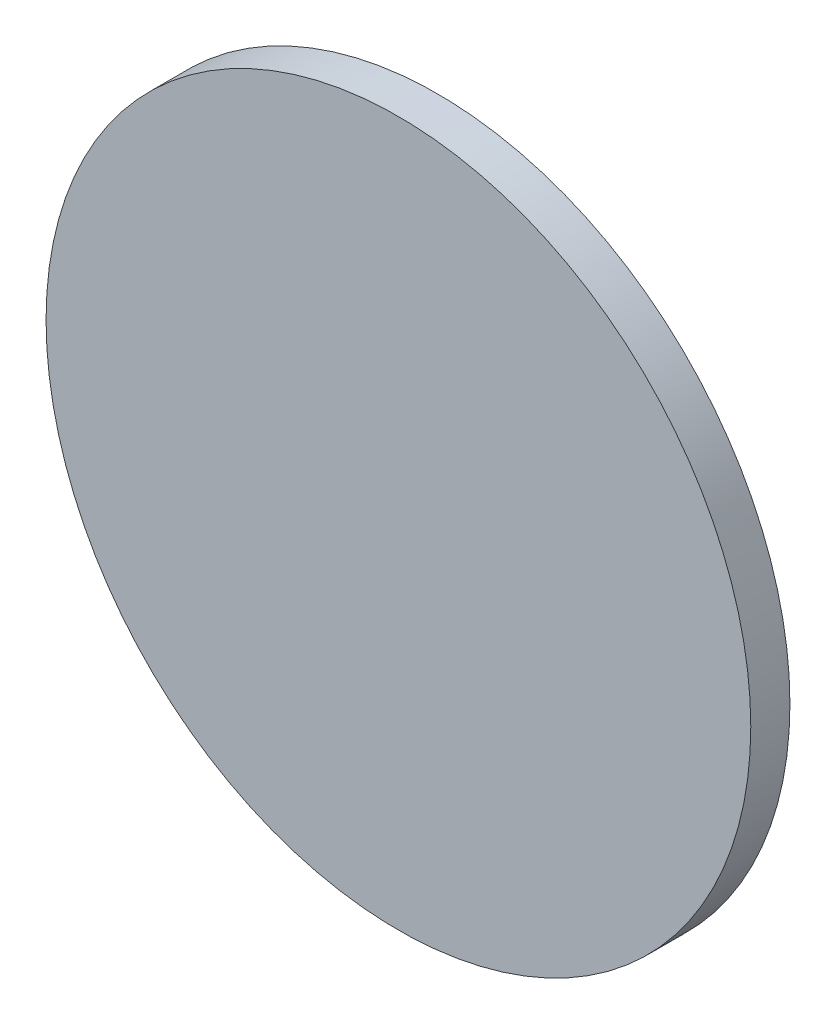
ISO-10303-21;
HEADER;
FILE_DESCRIPTION(('STEP AP214'),'2;1');
FILE_NAME('part.step','',(''),(''),'','','');
FILE_SCHEMA(('AUTOMOTIVE_DESIGN { 1 0 10303 214 1 1 1 1 }'));
ENDSEC;
DATA;
#1=APPLICATION_CONTEXT('core data for automotive mechanical design processes');
#2=APPLICATION_PROTOCOL_DEFINITION('international standard','automotive_design',2000,#1);
#3=PRODUCT_CONTEXT('',#1,'mechanical');
#4=PRODUCT('Part','Part','',(#3));
#5=PRODUCT_RELATED_PRODUCT_CATEGORY('part','',(#4));
#6=PRODUCT_DEFINITION_FORMATION('','',#4);
#7=PRODUCT_DEFINITION_CONTEXT('part definition',#1,'design');
#8=PRODUCT_DEFINITION('design','',#6,#7);
#9=PRODUCT_DEFINITION_SHAPE('','',#8);
#10=(LENGTH_UNIT() NAMED_UNIT(*) SI_UNIT(.MILLI.,.METRE.));
#11=(NAMED_UNIT(*) PLANE_ANGLE_UNIT() SI_UNIT($,.RADIAN.));
#12=(NAMED_UNIT(*) SI_UNIT($,.STERADIAN.) SOLID_ANGLE_UNIT());
#13=UNCERTAINTY_MEASURE_WITH_UNIT(LENGTH_MEASURE(1.E-05),#10,'distance_accuracy_value','');
#14=(GEOMETRIC_REPRESENTATION_CONTEXT(3) GLOBAL_UNCERTAINTY_ASSIGNED_CONTEXT((#13)) GLOBAL_UNIT_ASSIGNED_CONTEXT((#10,
#11,#12)) REPRESENTATION_CONTEXT('',''));
#15=CARTESIAN_POINT('',(0.,0.,0.));
#16=DIRECTION('',(0.,0.,1.));
#17=DIRECTION('',(1.,0.,0.));
#18=AXIS2_PLACEMENT_3D('',#15,#16,#17);
#19=CARTESIAN_POINT('',(0.,0.,-25.4));
#20=DIRECTION('',(0.,0.,1.));
#21=DIRECTION('',(1.,0.,0.));
#22=AXIS2_PLACEMENT_3D('',#19,#20,#21);
#23=CYLINDRICAL_SURFACE('',#22,228.6);
#24=CARTESIAN_POINT('',(0.,0.,-25.4));
#25=DIRECTION('',(0.,0.,1.));
#26=DIRECTION('',(1.,0.,0.));
#27=AXIS2_PLACEMENT_3D('',#24,#25,#26);
#28=CIRCLE('',#27,228.6);
#29=CARTESIAN_POINT('',(228.6,0.,-25.4));
#30=VERTEX_POINT('',#29);
#31=EDGE_CURVE('E10',#30,#30,#28,.T.);
#32=ORIENTED_EDGE('',*,*,#31,.T.);
#33=EDGE_LOOP('',(#32));
#34=FACE_BOUND('',#33,.T.);
#35=CARTESIAN_POINT('',(0.,0.,0.));
#36=DIRECTION('',(0.,0.,1.));
#37=DIRECTION('',(1.,0.,0.));
#38=AXIS2_PLACEMENT_3D('',#35,#36,#37);
#39=CIRCLE('',#38,228.6);
#40=CARTESIAN_POINT('',(228.6,0.,0.));
#41=VERTEX_POINT('',#40);
#42=EDGE_CURVE('E44',#41,#41,#39,.T.);
#43=ORIENTED_EDGE('',*,*,#42,.F.);
#44=EDGE_LOOP('',(#43));
#45=FACE_BOUND('',#44,.T.);
#46=ADVANCED_FACE('F38',(#34,#45),#23,.T.);
#47=CARTESIAN_POINT('',(0.,0.,-25.4));
#48=DIRECTION('',(0.,0.,1.));
#49=DIRECTION('',(1.,0.,0.));
#50=AXIS2_PLACEMENT_3D('',#47,#48,#49);
#51=PLANE('',#50);
#52=ORIENTED_EDGE('',*,*,#31,.F.);
#53=EDGE_LOOP('',(#52));
#54=FACE_BOUND('',#53,.T.);
#55=ADVANCED_FACE('F53',(#54),#51,.F.);
#56=CARTESIAN_POINT('',(0.,0.,0.));
#57=DIRECTION('',(0.,0.,1.));
#58=DIRECTION('',(1.,0.,0.));
#59=AXIS2_PLACEMENT_3D('',#56,#57,#58);
#60=PLANE('',#59);
#61=ORIENTED_EDGE('',*,*,#42,.T.);
#62=EDGE_LOOP('',(#61));
#63=FACE_BOUND('',#62,.T.);
#64=ADVANCED_FACE('F50',(#63),#60,.T.);
#65=CLOSED_SHELL('',(#46,#55,#64));
#66=MANIFOLD_SOLID_BREP('B2',#65);
#67=ADVANCED_BREP_SHAPE_REPRESENTATION('',(#18,#66),#14);
#68=SHAPE_DEFINITION_REPRESENTATION(#9,#67);
ENDSEC;
END-ISO-10303-21;
